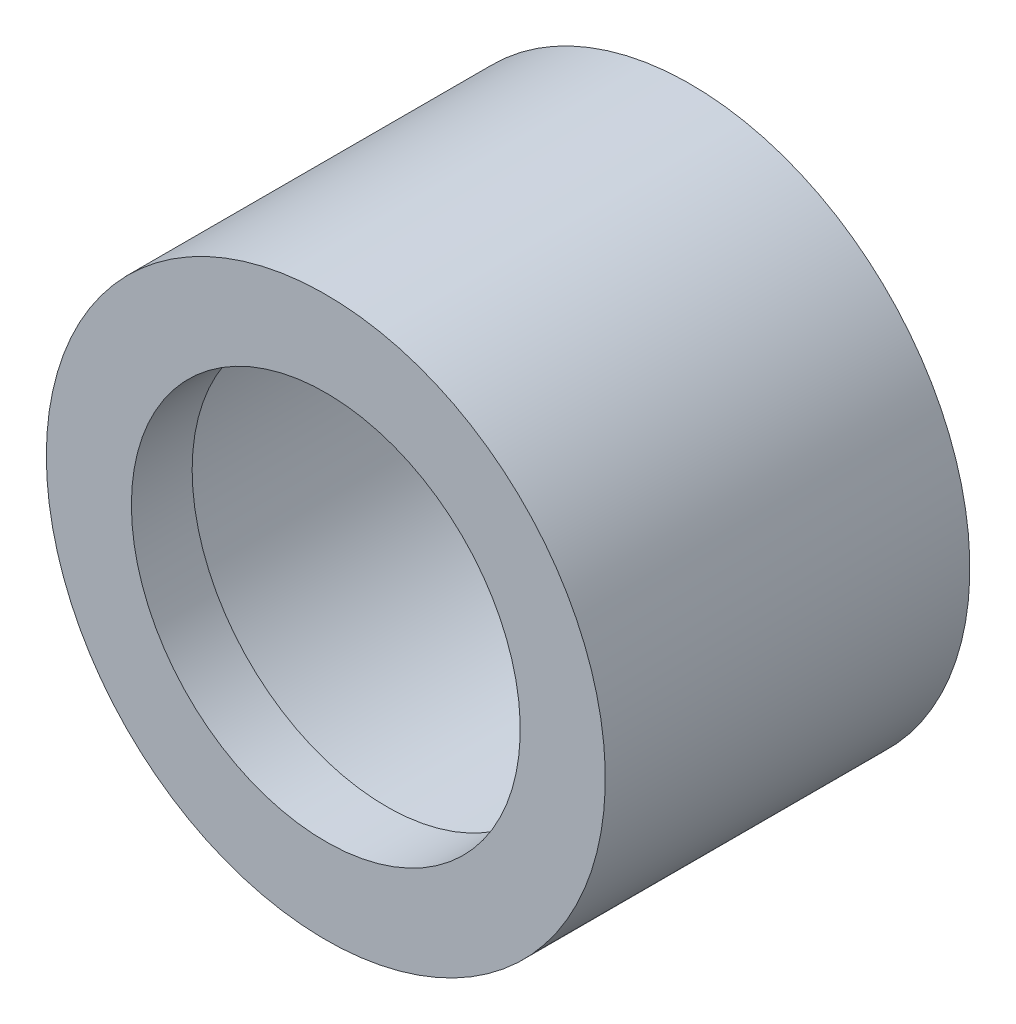
ISO-10303-21;
HEADER;
FILE_DESCRIPTION(('STEP AP214'),'2;1');
FILE_NAME('part.step','',(''),(''),'','','');
FILE_SCHEMA(('AUTOMOTIVE_DESIGN { 1 0 10303 214 1 1 1 1 }'));
ENDSEC;
DATA;
#1=APPLICATION_CONTEXT('core data for automotive mechanical design processes');
#2=APPLICATION_PROTOCOL_DEFINITION('international standard','automotive_design',2000,#1);
#3=PRODUCT_CONTEXT('',#1,'mechanical');
#4=PRODUCT('Part','Part','',(#3));
#5=PRODUCT_RELATED_PRODUCT_CATEGORY('part','',(#4));
#6=PRODUCT_DEFINITION_FORMATION('','',#4);
#7=PRODUCT_DEFINITION_CONTEXT('part definition',#1,'design');
#8=PRODUCT_DEFINITION('design','',#6,#7);
#9=PRODUCT_DEFINITION_SHAPE('','',#8);
#10=(LENGTH_UNIT() NAMED_UNIT(*) SI_UNIT(.MILLI.,.METRE.));
#11=(NAMED_UNIT(*) PLANE_ANGLE_UNIT() SI_UNIT($,.RADIAN.));
#12=(NAMED_UNIT(*) SI_UNIT($,.STERADIAN.) SOLID_ANGLE_UNIT());
#13=UNCERTAINTY_MEASURE_WITH_UNIT(LENGTH_MEASURE(1.E-05),#10,'distance_accuracy_value','');
#14=(GEOMETRIC_REPRESENTATION_CONTEXT(3) GLOBAL_UNCERTAINTY_ASSIGNED_CONTEXT((#13)) GLOBAL_UNIT_ASSIGNED_CONTEXT((#10,
#11,#12)) REPRESENTATION_CONTEXT('',''));
#15=CARTESIAN_POINT('',(0.,0.,0.));
#16=DIRECTION('',(0.,0.,1.));
#17=DIRECTION('',(1.,0.,0.));
#18=AXIS2_PLACEMENT_3D('',#15,#16,#17);
#19=CARTESIAN_POINT('',(-9.5,0.,-15.));
#20=DIRECTION('',(0.,0.,-1.));
#21=DIRECTION('',(-1.,0.,0.));
#22=AXIS2_PLACEMENT_3D('',#19,#20,#21);
#23=PLANE('',#22);
#24=CARTESIAN_POINT('',(0.,0.,-15.));
#25=DIRECTION('',(0.,0.,-1.));
#26=DIRECTION('',(-1.,0.,0.));
#27=AXIS2_PLACEMENT_3D('',#24,#25,#26);
#28=CIRCLE('',#27,11.5);
#29=CARTESIAN_POINT('',(-11.5,0.,-15.));
#30=VERTEX_POINT('',#29);
#31=EDGE_CURVE('E10',#30,#30,#28,.T.);
#32=ORIENTED_EDGE('',*,*,#31,.T.);
#33=EDGE_LOOP('',(#32));
#34=FACE_BOUND('',#33,.T.);
#35=CARTESIAN_POINT('',(0.,0.,-15.));
#36=DIRECTION('',(0.,0.,-1.));
#37=DIRECTION('',(-1.,0.,0.));
#38=AXIS2_PLACEMENT_3D('',#35,#36,#37);
#39=CIRCLE('',#38,9.5);
#40=CARTESIAN_POINT('',(-9.5,0.,-15.));
#41=VERTEX_POINT('',#40);
#42=EDGE_CURVE('E72',#41,#41,#39,.T.);
#43=ORIENTED_EDGE('',*,*,#42,.F.);
#44=EDGE_LOOP('',(#43));
#45=FACE_BOUND('',#44,.T.);
#46=ADVANCED_FACE('F45',(#34,#45),#23,.T.);
#47=CARTESIAN_POINT('',(0.,0.,-55.9602354645795));
#48=DIRECTION('',(0.,0.,-1.));
#49=DIRECTION('',(-1.,0.,0.));
#50=AXIS2_PLACEMENT_3D('',#47,#48,#49);
#51=CYLINDRICAL_SURFACE('',#50,11.5);
#52=CARTESIAN_POINT('',(0.,0.,0.));
#53=DIRECTION('',(0.,0.,-1.));
#54=DIRECTION('',(-1.,0.,0.));
#55=AXIS2_PLACEMENT_3D('',#52,#53,#54);
#56=CIRCLE('',#55,11.5);
#57=CARTESIAN_POINT('',(-11.5,0.,0.));
#58=VERTEX_POINT('',#57);
#59=EDGE_CURVE('E52',#58,#58,#56,.T.);
#60=ORIENTED_EDGE('',*,*,#59,.T.);
#61=EDGE_LOOP('',(#60));
#62=FACE_BOUND('',#61,.T.);
#63=ORIENTED_EDGE('',*,*,#31,.F.);
#64=EDGE_LOOP('',(#63));
#65=FACE_BOUND('',#64,.T.);
#66=ADVANCED_FACE('F81',(#62,#65),#51,.T.);
#67=CARTESIAN_POINT('',(-11.5,0.,0.));
#68=DIRECTION('',(0.,0.,1.));
#69=DIRECTION('',(1.,0.,0.));
#70=AXIS2_PLACEMENT_3D('',#67,#68,#69);
#71=PLANE('',#70);
#72=CARTESIAN_POINT('',(0.,0.,0.));
#73=DIRECTION('',(0.,0.,-1.));
#74=DIRECTION('',(-1.,0.,0.));
#75=AXIS2_PLACEMENT_3D('',#72,#73,#74);
#76=CIRCLE('',#75,8.);
#77=CARTESIAN_POINT('',(-8.,0.,0.));
#78=VERTEX_POINT('',#77);
#79=EDGE_CURVE('E57',#78,#78,#76,.T.);
#80=ORIENTED_EDGE('',*,*,#79,.T.);
#81=EDGE_LOOP('',(#80));
#82=FACE_BOUND('',#81,.T.);
#83=ORIENTED_EDGE('',*,*,#59,.F.);
#84=EDGE_LOOP('',(#83));
#85=FACE_BOUND('',#84,.T.);
#86=ADVANCED_FACE('F85',(#82,#85),#71,.T.);
#87=CARTESIAN_POINT('',(0.,0.,-55.9602354645795));
#88=DIRECTION('',(0.,0.,-1.));
#89=DIRECTION('',(-1.,0.,0.));
#90=AXIS2_PLACEMENT_3D('',#87,#88,#89);
#91=CYLINDRICAL_SURFACE('',#90,8.);
#92=CARTESIAN_POINT('',(0.,0.,-2.5));
#93=DIRECTION('',(0.,0.,-1.));
#94=DIRECTION('',(-1.,0.,0.));
#95=AXIS2_PLACEMENT_3D('',#92,#93,#94);
#96=CIRCLE('',#95,8.);
#97=CARTESIAN_POINT('',(-8.,0.,-2.5));
#98=VERTEX_POINT('',#97);
#99=EDGE_CURVE('E62',#98,#98,#96,.T.);
#100=ORIENTED_EDGE('',*,*,#99,.T.);
#101=EDGE_LOOP('',(#100));
#102=FACE_BOUND('',#101,.T.);
#103=ORIENTED_EDGE('',*,*,#79,.F.);
#104=EDGE_LOOP('',(#103));
#105=FACE_BOUND('',#104,.T.);
#106=ADVANCED_FACE('F89',(#102,#105),#91,.F.);
#107=CARTESIAN_POINT('',(-8.,0.,-2.5));
#108=DIRECTION('',(0.,0.,-1.));
#109=DIRECTION('',(-1.,0.,0.));
#110=AXIS2_PLACEMENT_3D('',#107,#108,#109);
#111=PLANE('',#110);
#112=CARTESIAN_POINT('',(0.,0.,-2.5));
#113=DIRECTION('',(0.,0.,-1.));
#114=DIRECTION('',(-1.,0.,0.));
#115=AXIS2_PLACEMENT_3D('',#112,#113,#114);
#116=CIRCLE('',#115,9.5);
#117=CARTESIAN_POINT('',(-9.5,0.,-2.5));
#118=VERTEX_POINT('',#117);
#119=EDGE_CURVE('E68',#118,#118,#116,.T.);
#120=ORIENTED_EDGE('',*,*,#119,.T.);
#121=EDGE_LOOP('',(#120));
#122=FACE_BOUND('',#121,.T.);
#123=ORIENTED_EDGE('',*,*,#99,.F.);
#124=EDGE_LOOP('',(#123));
#125=FACE_BOUND('',#124,.T.);
#126=ADVANCED_FACE('F96',(#122,#125),#111,.T.);
#127=CARTESIAN_POINT('',(0.,0.,-55.9602354645795));
#128=DIRECTION('',(0.,0.,-1.));
#129=DIRECTION('',(-1.,0.,0.));
#130=AXIS2_PLACEMENT_3D('',#127,#128,#129);
#131=CYLINDRICAL_SURFACE('',#130,9.5);
#132=ORIENTED_EDGE('',*,*,#42,.T.);
#133=EDGE_LOOP('',(#132));
#134=FACE_BOUND('',#133,.T.);
#135=ORIENTED_EDGE('',*,*,#119,.F.);
#136=EDGE_LOOP('',(#135));
#137=FACE_BOUND('',#136,.T.);
#138=ADVANCED_FACE('F77',(#134,#137),#131,.F.);
#139=CLOSED_SHELL('',(#46,#66,#86,#106,#126,#138));
#140=MANIFOLD_SOLID_BREP('B2',#139);
#141=ADVANCED_BREP_SHAPE_REPRESENTATION('',(#18,#140),#14);
#142=SHAPE_DEFINITION_REPRESENTATION(#9,#141);
ENDSEC;
END-ISO-10303-21;
